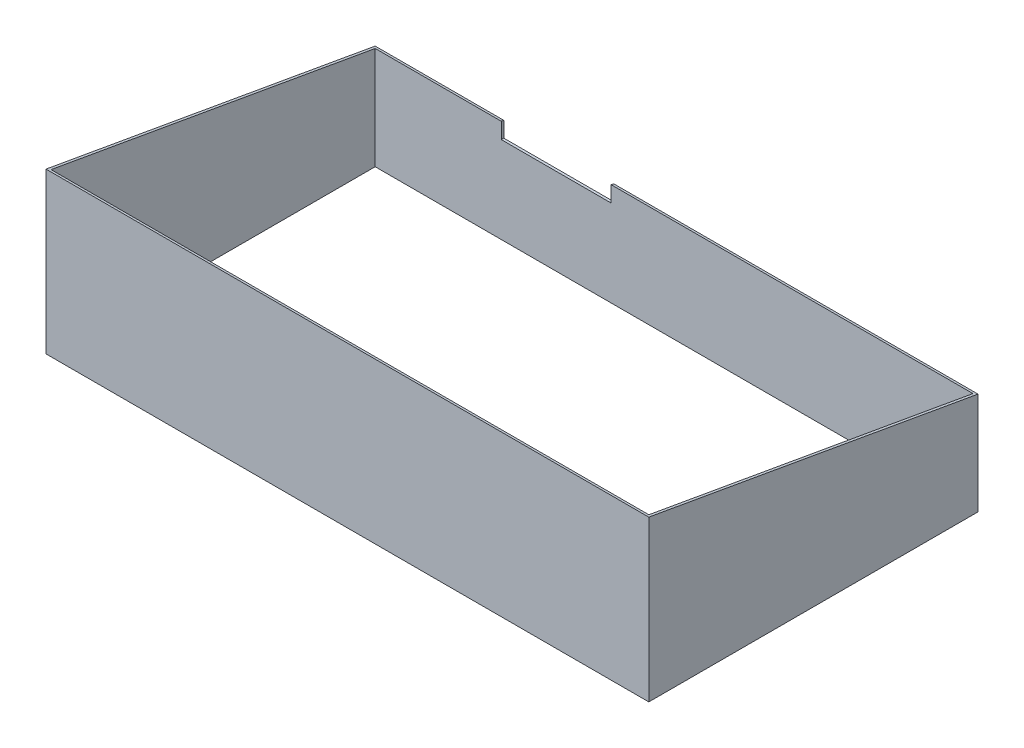
ISO-10303-21;
HEADER;
FILE_DESCRIPTION(('STEP AP214'),'2;1');
FILE_NAME('part.step','',(''),(''),'','','');
FILE_SCHEMA(('AUTOMOTIVE_DESIGN { 1 0 10303 214 1 1 1 1 }'));
ENDSEC;
DATA;
#1=APPLICATION_CONTEXT('core data for automotive mechanical design processes');
#2=APPLICATION_PROTOCOL_DEFINITION('international standard','automotive_design',2000,#1);
#3=PRODUCT_CONTEXT('',#1,'mechanical');
#4=PRODUCT('Part','Part','',(#3));
#5=PRODUCT_RELATED_PRODUCT_CATEGORY('part','',(#4));
#6=PRODUCT_DEFINITION_FORMATION('','',#4);
#7=PRODUCT_DEFINITION_CONTEXT('part definition',#1,'design');
#8=PRODUCT_DEFINITION('design','',#6,#7);
#9=PRODUCT_DEFINITION_SHAPE('','',#8);
#10=(LENGTH_UNIT() NAMED_UNIT(*) SI_UNIT(.MILLI.,.METRE.));
#11=(NAMED_UNIT(*) PLANE_ANGLE_UNIT() SI_UNIT($,.RADIAN.));
#12=(NAMED_UNIT(*) SI_UNIT($,.STERADIAN.) SOLID_ANGLE_UNIT());
#13=UNCERTAINTY_MEASURE_WITH_UNIT(LENGTH_MEASURE(1.E-05),#10,'distance_accuracy_value','');
#14=(GEOMETRIC_REPRESENTATION_CONTEXT(3) GLOBAL_UNCERTAINTY_ASSIGNED_CONTEXT((#13)) GLOBAL_UNIT_ASSIGNED_CONTEXT((#10,
#11,#12)) REPRESENTATION_CONTEXT('',''));
#15=CARTESIAN_POINT('',(0.,0.,0.));
#16=DIRECTION('',(0.,0.,1.));
#17=DIRECTION('',(1.,0.,0.));
#18=AXIS2_PLACEMENT_3D('',#15,#16,#17);
#19=CARTESIAN_POINT('',(1518.68,0.,0.));
#20=DIRECTION('',(0.,1.,0.));
#21=DIRECTION('',(0.,0.,1.));
#22=AXIS2_PLACEMENT_3D('',#19,#20,#21);
#23=PLANE('',#22);
#24=DIRECTION('',(0.,0.,-1.));
#25=VECTOR('',#24,1.);
#26=CARTESIAN_POINT('',(0.,0.,0.));
#27=LINE('',#26,#25);
#28=CARTESIAN_POINT('',(0.,0.,0.));
#29=VERTEX_POINT('',#28);
#30=CARTESIAN_POINT('',(0.,0.,-829.30660881158));
#31=VERTEX_POINT('',#30);
#32=EDGE_CURVE('E160',#29,#31,#27,.T.);
#33=ORIENTED_EDGE('',*,*,#32,.T.);
#34=DIRECTION('',(-1.,0.,0.));
#35=VECTOR('',#34,1.);
#36=CARTESIAN_POINT('',(1518.68,0.,-829.30660881158));
#37=LINE('',#36,#35);
#38=CARTESIAN_POINT('',(1518.68,0.,-829.30660881158));
#39=VERTEX_POINT('',#38);
#40=EDGE_CURVE('E11',#39,#31,#37,.T.);
#41=ORIENTED_EDGE('',*,*,#40,.F.);
#42=DIRECTION('',(0.,0.,-1.));
#43=VECTOR('',#42,1.);
#44=CARTESIAN_POINT('',(1518.68,0.,0.));
#45=LINE('',#44,#43);
#46=CARTESIAN_POINT('',(1518.68,0.,0.));
#47=VERTEX_POINT('',#46);
#48=EDGE_CURVE('E183',#47,#39,#45,.T.);
#49=ORIENTED_EDGE('',*,*,#48,.F.);
#50=DIRECTION('',(-1.,0.,0.));
#51=VECTOR('',#50,1.);
#52=CARTESIAN_POINT('',(1518.68,0.,0.));
#53=LINE('',#52,#51);
#54=EDGE_CURVE('E193',#47,#29,#53,.T.);
#55=ORIENTED_EDGE('',*,*,#54,.T.);
#56=EDGE_LOOP('',(#33,#41,#49,#55));
#57=FACE_BOUND('',#56,.T.);
#58=DIRECTION('',(0.,0.,-1.));
#59=VECTOR('',#58,1.);
#60=CARTESIAN_POINT('',(6.35000000000008,0.,0.));
#61=LINE('',#60,#59);
#62=CARTESIAN_POINT('',(6.35,0.,-6.35));
#63=VERTEX_POINT('',#62);
#64=CARTESIAN_POINT('',(6.35,0.,-822.956608811581));
#65=VERTEX_POINT('',#64);
#66=EDGE_CURVE('E179',#63,#65,#61,.T.);
#67=ORIENTED_EDGE('',*,*,#66,.F.);
#68=DIRECTION('',(-1.,0.,0.));
#69=VECTOR('',#68,1.);
#70=CARTESIAN_POINT('',(1518.68,0.,-6.35));
#71=LINE('',#70,#69);
#72=CARTESIAN_POINT('',(1512.33,0.,-6.35));
#73=VERTEX_POINT('',#72);
#74=EDGE_CURVE('E172',#73,#63,#71,.T.);
#75=ORIENTED_EDGE('',*,*,#74,.F.);
#76=DIRECTION('',(0.,0.,-1.));
#77=VECTOR('',#76,1.);
#78=CARTESIAN_POINT('',(1512.33,0.,0.));
#79=LINE('',#78,#77);
#80=CARTESIAN_POINT('',(1512.33,0.,-822.956608811581));
#81=VERTEX_POINT('',#80);
#82=EDGE_CURVE('E61',#73,#81,#79,.T.);
#83=ORIENTED_EDGE('',*,*,#82,.T.);
#84=DIRECTION('',(-1.,0.,0.));
#85=VECTOR('',#84,1.);
#86=CARTESIAN_POINT('',(1518.68,0.,-822.956608811581));
#87=LINE('',#86,#85);
#88=EDGE_CURVE('E156',#81,#65,#87,.T.);
#89=ORIENTED_EDGE('',*,*,#88,.T.);
#90=EDGE_LOOP('',(#67,#75,#83,#89));
#91=FACE_BOUND('',#90,.T.);
#92=ADVANCED_FACE('F39',(#57,#91),#23,.F.);
#93=CARTESIAN_POINT('',(1518.68,403.229130413323,1.22783687032115E-13));
#94=DIRECTION('',(0.,-0.984807753012208,0.173648177666931));
#95=DIRECTION('',(0.,-0.173648177666931,-0.984807753012208));
#96=AXIS2_PLACEMENT_3D('',#93,#94,#95);
#97=PLANE('',#96);
#98=DIRECTION('',(-1.,0.,0.));
#99=VECTOR('',#98,1.);
#100=CARTESIAN_POINT('',(1518.68,258.119676327499,-822.95660881158));
#101=LINE('',#100,#99);
#102=CARTESIAN_POINT('',(324.,258.119676327499,-822.956608811581));
#103=VERTEX_POINT('',#102);
#104=CARTESIAN_POINT('',(6.35,258.119676327499,-822.95660881158));
#105=VERTEX_POINT('',#104);
#106=EDGE_CURVE('E157',#103,#105,#101,.T.);
#107=ORIENTED_EDGE('',*,*,#106,.F.);
#108=DIRECTION('',(0.,0.173648177666931,0.984807753012208));
#109=VECTOR('',#108,1.);
#110=CARTESIAN_POINT('',(324.,257.335128258439,-827.406002012258));
#111=LINE('',#110,#109);
#112=CARTESIAN_POINT('',(324.,257.,-829.30660881158));
#113=VERTEX_POINT('',#112);
#114=EDGE_CURVE('E150',#113,#103,#111,.T.);
#115=ORIENTED_EDGE('',*,*,#114,.F.);
#116=DIRECTION('',(-1.,0.,0.));
#117=VECTOR('',#116,1.);
#118=CARTESIAN_POINT('',(1518.68,257.,-829.30660881158));
#119=LINE('',#118,#117);
#120=CARTESIAN_POINT('',(0.,257.,-829.30660881158));
#121=VERTEX_POINT('',#120);
#122=EDGE_CURVE('E206',#113,#121,#119,.T.);
#123=ORIENTED_EDGE('',*,*,#122,.T.);
#124=DIRECTION('',(0.,0.173648177666931,0.984807753012208));
#125=VECTOR('',#124,1.);
#126=CARTESIAN_POINT('',(0.,403.229130413323,1.22783687032115E-13));
#127=LINE('',#126,#125);
#128=CARTESIAN_POINT('',(0.,403.229130413323,1.22783687032115E-13));
#129=VERTEX_POINT('',#128);
#130=EDGE_CURVE('E199',#121,#129,#127,.T.);
#131=ORIENTED_EDGE('',*,*,#130,.T.);
#132=DIRECTION('',(-1.,0.,0.));
#133=VECTOR('',#132,1.);
#134=CARTESIAN_POINT('',(1518.68,403.229130413323,1.22783687032115E-13));
#135=LINE('',#134,#133);
#136=CARTESIAN_POINT('',(1518.68,403.229130413323,1.22783687032115E-13));
#137=VERTEX_POINT('',#136);
#138=EDGE_CURVE('E204',#137,#129,#135,.T.);
#139=ORIENTED_EDGE('',*,*,#138,.F.);
#140=DIRECTION('',(0.,0.173648177666931,0.984807753012208));
#141=VECTOR('',#140,1.);
#142=CARTESIAN_POINT('',(1518.68,403.229130413323,1.22783687032115E-13));
#143=LINE('',#142,#141);
#144=CARTESIAN_POINT('',(1518.68,257.,-829.30660881158));
#145=VERTEX_POINT('',#144);
#146=EDGE_CURVE('E189',#145,#137,#143,.T.);
#147=ORIENTED_EDGE('',*,*,#146,.F.);
#148=CARTESIAN_POINT('',(601.,257.,-829.30660881158));
#149=VERTEX_POINT('',#148);
#150=EDGE_CURVE('E46',#145,#149,#119,.T.);
#151=ORIENTED_EDGE('',*,*,#150,.T.);
#152=DIRECTION('',(0.,-0.173648177666931,-0.984807753012208));
#153=VECTOR('',#152,1.);
#154=CARTESIAN_POINT('',(601.,257.335128258439,-827.406002012258));
#155=LINE('',#154,#153);
#156=CARTESIAN_POINT('',(601.,258.119676327499,-822.95660881158));
#157=VERTEX_POINT('',#156);
#158=EDGE_CURVE('E131',#157,#149,#155,.T.);
#159=ORIENTED_EDGE('',*,*,#158,.F.);
#160=CARTESIAN_POINT('',(1512.33,258.119676327499,-822.95660881158));
#161=VERTEX_POINT('',#160);
#162=EDGE_CURVE('E147',#161,#157,#101,.T.);
#163=ORIENTED_EDGE('',*,*,#162,.F.);
#164=DIRECTION('',(0.,0.173648177666931,0.984807753012208));
#165=VECTOR('',#164,1.);
#166=CARTESIAN_POINT('',(1512.33,403.229130413323,1.22783687032115E-13));
#167=LINE('',#166,#165);
#168=CARTESIAN_POINT('',(1512.33,402.109454085824,-6.34999999999988));
#169=VERTEX_POINT('',#168);
#170=EDGE_CURVE('E173',#161,#169,#167,.T.);
#171=ORIENTED_EDGE('',*,*,#170,.T.);
#172=DIRECTION('',(-1.,0.,0.));
#173=VECTOR('',#172,1.);
#174=CARTESIAN_POINT('',(1518.68,402.109454085824,-6.34999999999988));
#175=LINE('',#174,#173);
#176=CARTESIAN_POINT('',(6.35,402.109454085824,-6.34999999999988));
#177=VERTEX_POINT('',#176);
#178=EDGE_CURVE('E162',#169,#177,#175,.T.);
#179=ORIENTED_EDGE('',*,*,#178,.T.);
#180=DIRECTION('',(0.,0.173648177666931,0.984807753012208));
#181=VECTOR('',#180,1.);
#182=CARTESIAN_POINT('',(6.35000000000008,403.229130413323,1.22783687032115E-13));
#183=LINE('',#182,#181);
#184=EDGE_CURVE('E167',#105,#177,#183,.T.);
#185=ORIENTED_EDGE('',*,*,#184,.F.);
#186=EDGE_LOOP('',(#107,#115,#123,#131,#139,#147,#151,#159,#163,#171,#179,#185));
#187=FACE_BOUND('',#186,.T.);
#188=ADVANCED_FACE('F145',(#187),#97,.F.);
#189=CARTESIAN_POINT('',(1518.68,0.,-829.30660881158));
#190=DIRECTION('',(0.,0.,1.));
#191=DIRECTION('',(0.,-1.,0.));
#192=AXIS2_PLACEMENT_3D('',#189,#190,#191);
#193=PLANE('',#192);
#194=ORIENTED_EDGE('',*,*,#122,.F.);
#195=DIRECTION('',(0.,1.,0.));
#196=VECTOR('',#195,1.);
#197=CARTESIAN_POINT('',(324.,268.119676327499,-829.30660881158));
#198=LINE('',#197,#196);
#199=CARTESIAN_POINT('',(324.,218.119676327499,-829.30660881158));
#200=VERTEX_POINT('',#199);
#201=EDGE_CURVE('E231',#200,#113,#198,.T.);
#202=ORIENTED_EDGE('',*,*,#201,.F.);
#203=DIRECTION('',(-1.,0.,0.));
#204=VECTOR('',#203,1.);
#205=CARTESIAN_POINT('',(324.,218.119676327499,-829.30660881158));
#206=LINE('',#205,#204);
#207=CARTESIAN_POINT('',(601.,218.119676327499,-829.30660881158));
#208=VERTEX_POINT('',#207);
#209=EDGE_CURVE('E182',#208,#200,#206,.T.);
#210=ORIENTED_EDGE('',*,*,#209,.F.);
#211=DIRECTION('',(0.,-1.,0.));
#212=VECTOR('',#211,1.);
#213=CARTESIAN_POINT('',(601.,268.119676327499,-829.30660881158));
#214=LINE('',#213,#212);
#215=EDGE_CURVE('E229',#149,#208,#214,.T.);
#216=ORIENTED_EDGE('',*,*,#215,.F.);
#217=ORIENTED_EDGE('',*,*,#150,.F.);
#218=DIRECTION('',(0.,1.,0.));
#219=VECTOR('',#218,1.);
#220=CARTESIAN_POINT('',(1518.68,0.,-829.30660881158));
#221=LINE('',#220,#219);
#222=EDGE_CURVE('E186',#39,#145,#221,.T.);
#223=ORIENTED_EDGE('',*,*,#222,.F.);
#224=ORIENTED_EDGE('',*,*,#40,.T.);
#225=DIRECTION('',(0.,1.,0.));
#226=VECTOR('',#225,1.);
#227=CARTESIAN_POINT('',(0.,0.,-829.30660881158));
#228=LINE('',#227,#226);
#229=EDGE_CURVE('E196',#31,#121,#228,.T.);
#230=ORIENTED_EDGE('',*,*,#229,.T.);
#231=EDGE_LOOP('',(#194,#202,#210,#216,#217,#223,#224,#230));
#232=FACE_BOUND('',#231,.T.);
#233=ADVANCED_FACE('F213',(#232),#193,.F.);
#234=CARTESIAN_POINT('',(1518.68,403.229130413323,1.22783687032115E-13));
#235=DIRECTION('',(0.,0.,-1.));
#236=DIRECTION('',(0.,1.,0.));
#237=AXIS2_PLACEMENT_3D('',#234,#235,#236);
#238=PLANE('',#237);
#239=DIRECTION('',(0.,-1.,0.));
#240=VECTOR('',#239,1.);
#241=CARTESIAN_POINT('',(0.,403.229130413323,1.22783687032115E-13));
#242=LINE('',#241,#240);
#243=EDGE_CURVE('E187',#129,#29,#242,.T.);
#244=ORIENTED_EDGE('',*,*,#243,.T.);
#245=ORIENTED_EDGE('',*,*,#54,.F.);
#246=DIRECTION('',(0.,-1.,0.));
#247=VECTOR('',#246,1.);
#248=CARTESIAN_POINT('',(1518.68,403.229130413323,1.22783687032115E-13));
#249=LINE('',#248,#247);
#250=EDGE_CURVE('E191',#137,#47,#249,.T.);
#251=ORIENTED_EDGE('',*,*,#250,.F.);
#252=ORIENTED_EDGE('',*,*,#138,.T.);
#253=EDGE_LOOP('',(#244,#245,#251,#252));
#254=FACE_BOUND('',#253,.T.);
#255=ADVANCED_FACE('F221',(#254),#238,.F.);
#256=CARTESIAN_POINT('',(1518.68,0.,0.));
#257=DIRECTION('',(1.,0.,0.));
#258=DIRECTION('',(0.,0.,-1.));
#259=AXIS2_PLACEMENT_3D('',#256,#257,#258);
#260=PLANE('',#259);
#261=ORIENTED_EDGE('',*,*,#48,.T.);
#262=ORIENTED_EDGE('',*,*,#222,.T.);
#263=ORIENTED_EDGE('',*,*,#146,.T.);
#264=ORIENTED_EDGE('',*,*,#250,.T.);
#265=EDGE_LOOP('',(#261,#262,#263,#264));
#266=FACE_BOUND('',#265,.T.);
#267=ADVANCED_FACE('F227',(#266),#260,.T.);
#268=CARTESIAN_POINT('',(0.,0.,0.));
#269=DIRECTION('',(1.,0.,0.));
#270=DIRECTION('',(0.,0.,-1.));
#271=AXIS2_PLACEMENT_3D('',#268,#269,#270);
#272=PLANE('',#271);
#273=ORIENTED_EDGE('',*,*,#32,.F.);
#274=ORIENTED_EDGE('',*,*,#243,.F.);
#275=ORIENTED_EDGE('',*,*,#130,.F.);
#276=ORIENTED_EDGE('',*,*,#229,.F.);
#277=EDGE_LOOP('',(#273,#274,#275,#276));
#278=FACE_BOUND('',#277,.T.);
#279=ADVANCED_FACE('F218',(#278),#272,.F.);
#280=CARTESIAN_POINT('',(1518.68,0.,-822.956608811581));
#281=DIRECTION('',(0.,0.,1.));
#282=DIRECTION('',(0.,-1.,0.));
#283=AXIS2_PLACEMENT_3D('',#280,#281,#282);
#284=PLANE('',#283);
#285=DIRECTION('',(0.,-1.,0.));
#286=VECTOR('',#285,1.);
#287=CARTESIAN_POINT('',(324.,268.119676327499,-822.956608811581));
#288=LINE('',#287,#286);
#289=CARTESIAN_POINT('',(324.,218.119676327499,-822.95660881158));
#290=VERTEX_POINT('',#289);
#291=EDGE_CURVE('E53',#103,#290,#288,.T.);
#292=ORIENTED_EDGE('',*,*,#291,.F.);
#293=ORIENTED_EDGE('',*,*,#106,.T.);
#294=DIRECTION('',(0.,1.,0.));
#295=VECTOR('',#294,1.);
#296=CARTESIAN_POINT('',(6.35000000000008,0.,-822.956608811581));
#297=LINE('',#296,#295);
#298=EDGE_CURVE('E169',#65,#105,#297,.T.);
#299=ORIENTED_EDGE('',*,*,#298,.F.);
#300=ORIENTED_EDGE('',*,*,#88,.F.);
#301=DIRECTION('',(0.,1.,0.));
#302=VECTOR('',#301,1.);
#303=CARTESIAN_POINT('',(1512.33,0.,-822.956608811581));
#304=LINE('',#303,#302);
#305=EDGE_CURVE('E155',#81,#161,#304,.T.);
#306=ORIENTED_EDGE('',*,*,#305,.T.);
#307=ORIENTED_EDGE('',*,*,#162,.T.);
#308=DIRECTION('',(0.,1.,0.));
#309=VECTOR('',#308,1.);
#310=CARTESIAN_POINT('',(601.,268.119676327499,-822.956608811581));
#311=LINE('',#310,#309);
#312=CARTESIAN_POINT('',(601.,218.119676327499,-822.956608811581));
#313=VERTEX_POINT('',#312);
#314=EDGE_CURVE('E127',#313,#157,#311,.T.);
#315=ORIENTED_EDGE('',*,*,#314,.F.);
#316=DIRECTION('',(1.,0.,0.));
#317=VECTOR('',#316,1.);
#318=CARTESIAN_POINT('',(324.,218.119676327499,-822.956608811581));
#319=LINE('',#318,#317);
#320=EDGE_CURVE('E139',#290,#313,#319,.T.);
#321=ORIENTED_EDGE('',*,*,#320,.F.);
#322=EDGE_LOOP('',(#292,#293,#299,#300,#306,#307,#315,#321));
#323=FACE_BOUND('',#322,.T.);
#324=ADVANCED_FACE('F153',(#323),#284,.T.);
#325=CARTESIAN_POINT('',(1518.68,403.229130413323,-6.34999999999988));
#326=DIRECTION('',(0.,0.,-1.));
#327=DIRECTION('',(0.,1.,0.));
#328=AXIS2_PLACEMENT_3D('',#325,#326,#327);
#329=PLANE('',#328);
#330=DIRECTION('',(0.,-1.,0.));
#331=VECTOR('',#330,1.);
#332=CARTESIAN_POINT('',(6.35000000000008,403.229130413323,-6.34999999999988));
#333=LINE('',#332,#331);
#334=EDGE_CURVE('E165',#177,#63,#333,.T.);
#335=ORIENTED_EDGE('',*,*,#334,.F.);
#336=ORIENTED_EDGE('',*,*,#178,.F.);
#337=DIRECTION('',(0.,-1.,0.));
#338=VECTOR('',#337,1.);
#339=CARTESIAN_POINT('',(1512.33,403.229130413323,-6.34999999999988));
#340=LINE('',#339,#338);
#341=EDGE_CURVE('E174',#169,#73,#340,.T.);
#342=ORIENTED_EDGE('',*,*,#341,.T.);
#343=ORIENTED_EDGE('',*,*,#74,.T.);
#344=EDGE_LOOP('',(#335,#336,#342,#343));
#345=FACE_BOUND('',#344,.T.);
#346=ADVANCED_FACE('F246',(#345),#329,.T.);
#347=CARTESIAN_POINT('',(1512.33,0.,0.));
#348=DIRECTION('',(1.,0.,0.));
#349=DIRECTION('',(0.,0.,-1.));
#350=AXIS2_PLACEMENT_3D('',#347,#348,#349);
#351=PLANE('',#350);
#352=ORIENTED_EDGE('',*,*,#82,.F.);
#353=ORIENTED_EDGE('',*,*,#341,.F.);
#354=ORIENTED_EDGE('',*,*,#170,.F.);
#355=ORIENTED_EDGE('',*,*,#305,.F.);
#356=EDGE_LOOP('',(#352,#353,#354,#355));
#357=FACE_BOUND('',#356,.T.);
#358=ADVANCED_FACE('F251',(#357),#351,.F.);
#359=CARTESIAN_POINT('',(6.35,0.,0.));
#360=DIRECTION('',(1.,0.,0.));
#361=DIRECTION('',(0.,0.,-1.));
#362=AXIS2_PLACEMENT_3D('',#359,#360,#361);
#363=PLANE('',#362);
#364=ORIENTED_EDGE('',*,*,#66,.T.);
#365=ORIENTED_EDGE('',*,*,#298,.T.);
#366=ORIENTED_EDGE('',*,*,#184,.T.);
#367=ORIENTED_EDGE('',*,*,#334,.T.);
#368=EDGE_LOOP('',(#364,#365,#366,#367));
#369=FACE_BOUND('',#368,.T.);
#370=ADVANCED_FACE('F249',(#369),#363,.T.);
#371=CARTESIAN_POINT('',(324.,268.119676327499,-829.307608811581));
#372=DIRECTION('',(-1.,0.,0.));
#373=DIRECTION('',(0.,0.,1.));
#374=AXIS2_PLACEMENT_3D('',#371,#372,#373);
#375=PLANE('',#374);
#376=ORIENTED_EDGE('',*,*,#114,.T.);
#377=ORIENTED_EDGE('',*,*,#291,.T.);
#378=DIRECTION('',(0.,0.,1.));
#379=VECTOR('',#378,1.);
#380=CARTESIAN_POINT('',(324.,218.119676327499,-829.307608811581));
#381=LINE('',#380,#379);
#382=EDGE_CURVE('E138',#200,#290,#381,.T.);
#383=ORIENTED_EDGE('',*,*,#382,.F.);
#384=ORIENTED_EDGE('',*,*,#201,.T.);
#385=EDGE_LOOP('',(#376,#377,#383,#384));
#386=FACE_BOUND('',#385,.T.);
#387=ADVANCED_FACE('F254',(#386),#375,.F.);
#388=CARTESIAN_POINT('',(601.,268.119676327499,-829.307608811581));
#389=DIRECTION('',(1.,0.,0.));
#390=DIRECTION('',(0.,1.,0.));
#391=AXIS2_PLACEMENT_3D('',#388,#389,#390);
#392=PLANE('',#391);
#393=ORIENTED_EDGE('',*,*,#158,.T.);
#394=ORIENTED_EDGE('',*,*,#215,.T.);
#395=DIRECTION('',(0.,0.,1.));
#396=VECTOR('',#395,1.);
#397=CARTESIAN_POINT('',(601.,218.119676327499,-829.307608811581));
#398=LINE('',#397,#396);
#399=EDGE_CURVE('E133',#208,#313,#398,.T.);
#400=ORIENTED_EDGE('',*,*,#399,.T.);
#401=ORIENTED_EDGE('',*,*,#314,.T.);
#402=EDGE_LOOP('',(#393,#394,#400,#401));
#403=FACE_BOUND('',#402,.T.);
#404=ADVANCED_FACE('F129',(#403),#392,.F.);
#405=CARTESIAN_POINT('',(324.,218.119676327499,-829.307608811581));
#406=DIRECTION('',(0.,-1.,0.));
#407=DIRECTION('',(0.,0.,-1.));
#408=AXIS2_PLACEMENT_3D('',#405,#406,#407);
#409=PLANE('',#408);
#410=ORIENTED_EDGE('',*,*,#209,.T.);
#411=ORIENTED_EDGE('',*,*,#382,.T.);
#412=ORIENTED_EDGE('',*,*,#320,.T.);
#413=ORIENTED_EDGE('',*,*,#399,.F.);
#414=EDGE_LOOP('',(#410,#411,#412,#413));
#415=FACE_BOUND('',#414,.T.);
#416=ADVANCED_FACE('F253',(#415),#409,.F.);
#417=CLOSED_SHELL('',(#92,#188,#233,#255,#267,#279,#324,#346,#358,#370,#387,#404,#416));
#418=MANIFOLD_SOLID_BREP('B2',#417);
#419=ADVANCED_BREP_SHAPE_REPRESENTATION('',(#18,#418),#14);
#420=SHAPE_DEFINITION_REPRESENTATION(#9,#419);
ENDSEC;
END-ISO-10303-21;
